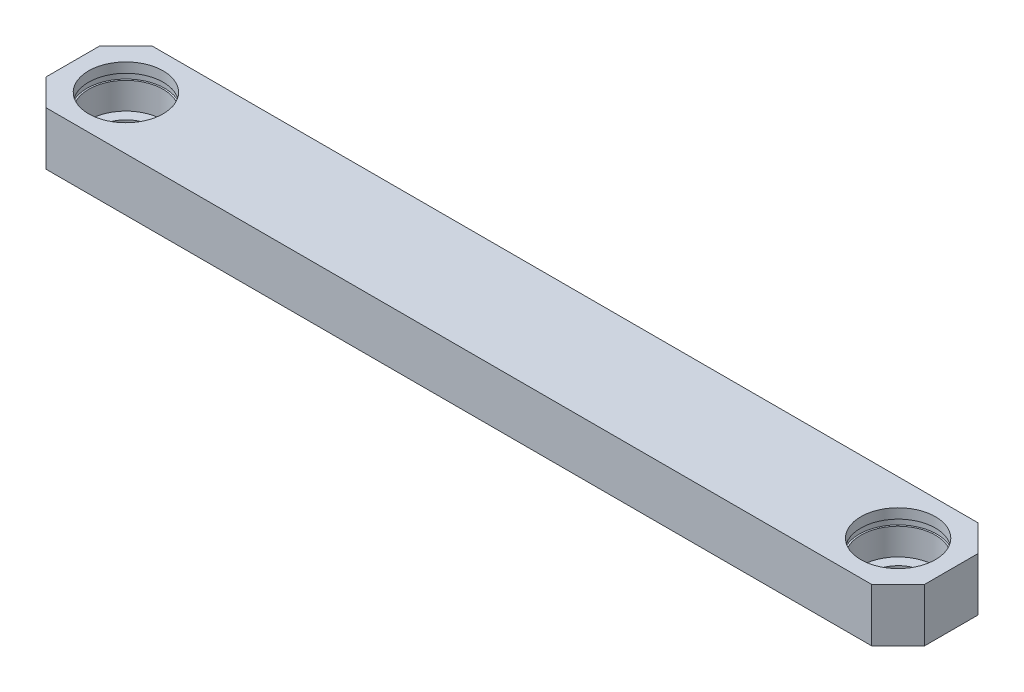
ISO-10303-21;
HEADER;
FILE_DESCRIPTION(('STEP AP214'),'2;1');
FILE_NAME('part.step','',(''),(''),'','','');
FILE_SCHEMA(('AUTOMOTIVE_DESIGN { 1 0 10303 214 1 1 1 1 }'));
ENDSEC;
DATA;
#1=APPLICATION_CONTEXT('core data for automotive mechanical design processes');
#2=APPLICATION_PROTOCOL_DEFINITION('international standard','automotive_design',2000,#1);
#3=PRODUCT_CONTEXT('',#1,'mechanical');
#4=PRODUCT('Part','Part','',(#3));
#5=PRODUCT_RELATED_PRODUCT_CATEGORY('part','',(#4));
#6=PRODUCT_DEFINITION_FORMATION('','',#4);
#7=PRODUCT_DEFINITION_CONTEXT('part definition',#1,'design');
#8=PRODUCT_DEFINITION('design','',#6,#7);
#9=PRODUCT_DEFINITION_SHAPE('','',#8);
#10=(LENGTH_UNIT() NAMED_UNIT(*) SI_UNIT(.MILLI.,.METRE.));
#11=(NAMED_UNIT(*) PLANE_ANGLE_UNIT() SI_UNIT($,.RADIAN.));
#12=(NAMED_UNIT(*) SI_UNIT($,.STERADIAN.) SOLID_ANGLE_UNIT());
#13=UNCERTAINTY_MEASURE_WITH_UNIT(LENGTH_MEASURE(1.E-05),#10,'distance_accuracy_value','');
#14=(GEOMETRIC_REPRESENTATION_CONTEXT(3) GLOBAL_UNCERTAINTY_ASSIGNED_CONTEXT((#13)) GLOBAL_UNIT_ASSIGNED_CONTEXT((#10,
#11,#12)) REPRESENTATION_CONTEXT('',''));
#15=CARTESIAN_POINT('',(0.,0.,0.));
#16=DIRECTION('',(0.,0.,1.));
#17=DIRECTION('',(1.,0.,0.));
#18=AXIS2_PLACEMENT_3D('',#15,#16,#17);
#19=CARTESIAN_POINT('',(0.,10.,-10.));
#20=DIRECTION('',(1.,0.,0.));
#21=DIRECTION('',(0.,0.,-1.));
#22=AXIS2_PLACEMENT_3D('',#19,#20,#21);
#23=PLANE('',#22);
#24=DIRECTION('',(0.,0.,1.));
#25=VECTOR('',#24,1.);
#26=CARTESIAN_POINT('',(0.,10.,-10.));
#27=LINE('',#26,#25);
#28=CARTESIAN_POINT('',(0.,10.,-5.00000000000001));
#29=VERTEX_POINT('',#28);
#30=CARTESIAN_POINT('',(0.,10.,4.99999999999998));
#31=VERTEX_POINT('',#30);
#32=EDGE_CURVE('E118',#29,#31,#27,.T.);
#33=ORIENTED_EDGE('',*,*,#32,.F.);
#34=DIRECTION('',(0.,-1.,0.));
#35=VECTOR('',#34,1.);
#36=CARTESIAN_POINT('',(0.,10.,-5.00000000000001));
#37=LINE('',#36,#35);
#38=CARTESIAN_POINT('',(0.,0.,-5.00000000000001));
#39=VERTEX_POINT('',#38);
#40=EDGE_CURVE('E103',#29,#39,#37,.T.);
#41=ORIENTED_EDGE('',*,*,#40,.T.);
#42=DIRECTION('',(0.,0.,1.));
#43=VECTOR('',#42,1.);
#44=CARTESIAN_POINT('',(0.,0.,-10.));
#45=LINE('',#44,#43);
#46=CARTESIAN_POINT('',(0.,0.,4.99999999999998));
#47=VERTEX_POINT('',#46);
#48=EDGE_CURVE('E115',#39,#47,#45,.T.);
#49=ORIENTED_EDGE('',*,*,#48,.T.);
#50=DIRECTION('',(0.,1.,0.));
#51=VECTOR('',#50,1.);
#52=CARTESIAN_POINT('',(0.,10.,4.99999999999998));
#53=LINE('',#52,#51);
#54=EDGE_CURVE('E120',#47,#31,#53,.T.);
#55=ORIENTED_EDGE('',*,*,#54,.T.);
#56=EDGE_LOOP('',(#33,#41,#49,#55));
#57=FACE_BOUND('',#56,.T.);
#58=ADVANCED_FACE('F33',(#57),#23,.F.);
#59=CARTESIAN_POINT('',(0.,10.,10.));
#60=DIRECTION('',(0.,0.,-1.));
#61=DIRECTION('',(-1.,0.,0.));
#62=AXIS2_PLACEMENT_3D('',#59,#60,#61);
#63=PLANE('',#62);
#64=DIRECTION('',(1.,0.,0.));
#65=VECTOR('',#64,1.);
#66=CARTESIAN_POINT('',(0.,0.,10.));
#67=LINE('',#66,#65);
#68=CARTESIAN_POINT('',(4.99999999999999,0.,10.));
#69=VERTEX_POINT('',#68);
#70=CARTESIAN_POINT('',(160.,0.,10.));
#71=VERTEX_POINT('',#70);
#72=EDGE_CURVE('E124',#69,#71,#67,.T.);
#73=ORIENTED_EDGE('',*,*,#72,.T.);
#74=DIRECTION('',(0.,1.,0.));
#75=VECTOR('',#74,1.);
#76=CARTESIAN_POINT('',(160.,10.,10.));
#77=LINE('',#76,#75);
#78=CARTESIAN_POINT('',(160.,10.,10.));
#79=VERTEX_POINT('',#78);
#80=EDGE_CURVE('E11',#71,#79,#77,.T.);
#81=ORIENTED_EDGE('',*,*,#80,.T.);
#82=DIRECTION('',(1.,0.,0.));
#83=VECTOR('',#82,1.);
#84=CARTESIAN_POINT('',(0.,10.,10.));
#85=LINE('',#84,#83);
#86=CARTESIAN_POINT('',(4.99999999999999,10.,10.));
#87=VERTEX_POINT('',#86);
#88=EDGE_CURVE('E164',#87,#79,#85,.T.);
#89=ORIENTED_EDGE('',*,*,#88,.F.);
#90=DIRECTION('',(0.,-1.,0.));
#91=VECTOR('',#90,1.);
#92=CARTESIAN_POINT('',(4.99999999999999,10.,10.));
#93=LINE('',#92,#91);
#94=EDGE_CURVE('E41',#87,#69,#93,.T.);
#95=ORIENTED_EDGE('',*,*,#94,.T.);
#96=EDGE_LOOP('',(#73,#81,#89,#95));
#97=FACE_BOUND('',#96,.T.);
#98=ADVANCED_FACE('F162',(#97),#63,.F.);
#99=CARTESIAN_POINT('',(165.,10.,-10.));
#100=DIRECTION('',(-1.,0.,0.));
#101=DIRECTION('',(0.,0.,1.));
#102=AXIS2_PLACEMENT_3D('',#99,#100,#101);
#103=PLANE('',#102);
#104=DIRECTION('',(0.,0.,-1.));
#105=VECTOR('',#104,1.);
#106=CARTESIAN_POINT('',(165.,0.,-10.));
#107=LINE('',#106,#105);
#108=CARTESIAN_POINT('',(165.,0.,5.00000000000001));
#109=VERTEX_POINT('',#108);
#110=CARTESIAN_POINT('',(165.,0.,-5.));
#111=VERTEX_POINT('',#110);
#112=EDGE_CURVE('E128',#109,#111,#107,.T.);
#113=ORIENTED_EDGE('',*,*,#112,.T.);
#114=DIRECTION('',(0.,1.,0.));
#115=VECTOR('',#114,1.);
#116=CARTESIAN_POINT('',(165.,10.,-5.));
#117=LINE('',#116,#115);
#118=CARTESIAN_POINT('',(165.,10.,-5.));
#119=VERTEX_POINT('',#118);
#120=EDGE_CURVE('E48',#111,#119,#117,.T.);
#121=ORIENTED_EDGE('',*,*,#120,.T.);
#122=DIRECTION('',(0.,0.,-1.));
#123=VECTOR('',#122,1.);
#124=CARTESIAN_POINT('',(165.,10.,-10.));
#125=LINE('',#124,#123);
#126=CARTESIAN_POINT('',(165.,10.,5.00000000000001));
#127=VERTEX_POINT('',#126);
#128=EDGE_CURVE('E172',#127,#119,#125,.T.);
#129=ORIENTED_EDGE('',*,*,#128,.F.);
#130=DIRECTION('',(0.,-1.,0.));
#131=VECTOR('',#130,1.);
#132=CARTESIAN_POINT('',(165.,10.,5.00000000000001));
#133=LINE('',#132,#131);
#134=EDGE_CURVE('E155',#127,#109,#133,.T.);
#135=ORIENTED_EDGE('',*,*,#134,.T.);
#136=EDGE_LOOP('',(#113,#121,#129,#135));
#137=FACE_BOUND('',#136,.T.);
#138=ADVANCED_FACE('F171',(#137),#103,.F.);
#139=CARTESIAN_POINT('',(0.,10.,-10.));
#140=DIRECTION('',(0.,0.,1.));
#141=DIRECTION('',(1.,0.,0.));
#142=AXIS2_PLACEMENT_3D('',#139,#140,#141);
#143=PLANE('',#142);
#144=DIRECTION('',(-1.,0.,0.));
#145=VECTOR('',#144,1.);
#146=CARTESIAN_POINT('',(0.,0.,-10.));
#147=LINE('',#146,#145);
#148=CARTESIAN_POINT('',(160.,0.,-10.));
#149=VERTEX_POINT('',#148);
#150=CARTESIAN_POINT('',(5.00000000000001,0.,-10.));
#151=VERTEX_POINT('',#150);
#152=EDGE_CURVE('E138',#149,#151,#147,.T.);
#153=ORIENTED_EDGE('',*,*,#152,.T.);
#154=DIRECTION('',(0.,1.,0.));
#155=VECTOR('',#154,1.);
#156=CARTESIAN_POINT('',(5.00000000000001,10.,-10.));
#157=LINE('',#156,#155);
#158=CARTESIAN_POINT('',(5.00000000000001,10.,-10.));
#159=VERTEX_POINT('',#158);
#160=EDGE_CURVE('E104',#151,#159,#157,.T.);
#161=ORIENTED_EDGE('',*,*,#160,.T.);
#162=DIRECTION('',(-1.,0.,0.));
#163=VECTOR('',#162,1.);
#164=CARTESIAN_POINT('',(0.,10.,-10.));
#165=LINE('',#164,#163);
#166=CARTESIAN_POINT('',(160.,10.,-10.));
#167=VERTEX_POINT('',#166);
#168=EDGE_CURVE('E134',#167,#159,#165,.T.);
#169=ORIENTED_EDGE('',*,*,#168,.F.);
#170=DIRECTION('',(0.,-1.,0.));
#171=VECTOR('',#170,1.);
#172=CARTESIAN_POINT('',(160.,10.,-10.));
#173=LINE('',#172,#171);
#174=EDGE_CURVE('E109',#167,#149,#173,.T.);
#175=ORIENTED_EDGE('',*,*,#174,.T.);
#176=EDGE_LOOP('',(#153,#161,#169,#175));
#177=FACE_BOUND('',#176,.T.);
#178=ADVANCED_FACE('F228',(#177),#143,.F.);
#179=CARTESIAN_POINT('',(0.,10.,0.));
#180=DIRECTION('',(0.,1.,0.));
#181=DIRECTION('',(0.,0.,1.));
#182=AXIS2_PLACEMENT_3D('',#179,#180,#181);
#183=PLANE('',#182);
#184=CARTESIAN_POINT('',(155.,10.,0.));
#185=DIRECTION('',(0.,1.,0.));
#186=DIRECTION('',(0.,0.,1.));
#187=AXIS2_PLACEMENT_3D('',#184,#185,#186);
#188=CIRCLE('',#187,7.00000000000001);
#189=CARTESIAN_POINT('',(155.,10.,7.00000000000001));
#190=VERTEX_POINT('',#189);
#191=EDGE_CURVE('E219',#190,#190,#188,.T.);
#192=ORIENTED_EDGE('',*,*,#191,.F.);
#193=EDGE_LOOP('',(#192));
#194=FACE_BOUND('',#193,.T.);
#195=CARTESIAN_POINT('',(10.,10.,0.));
#196=DIRECTION('',(0.,1.,0.));
#197=DIRECTION('',(-1.,0.,0.));
#198=AXIS2_PLACEMENT_3D('',#195,#196,#197);
#199=CIRCLE('',#198,7.);
#200=CARTESIAN_POINT('',(3.,10.,0.));
#201=VERTEX_POINT('',#200);
#202=EDGE_CURVE('E192',#201,#201,#199,.T.);
#203=ORIENTED_EDGE('',*,*,#202,.F.);
#204=EDGE_LOOP('',(#203));
#205=FACE_BOUND('',#204,.T.);
#206=ORIENTED_EDGE('',*,*,#168,.T.);
#207=DIRECTION('',(0.707106781186549,0.,-0.707106781186547));
#208=VECTOR('',#207,1.);
#209=CARTESIAN_POINT('',(-2.5,10.,-2.50000000000001));
#210=LINE('',#209,#208);
#211=EDGE_CURVE('E153',#159,#29,#210,.F.);
#212=ORIENTED_EDGE('',*,*,#211,.T.);
#213=ORIENTED_EDGE('',*,*,#32,.T.);
#214=DIRECTION('',(-0.707106781186546,0.,-0.70710678118655));
#215=VECTOR('',#214,1.);
#216=CARTESIAN_POINT('',(-2.49999999999999,10.,2.49999999999997));
#217=LINE('',#216,#215);
#218=EDGE_CURVE('E148',#31,#87,#217,.F.);
#219=ORIENTED_EDGE('',*,*,#218,.T.);
#220=ORIENTED_EDGE('',*,*,#88,.T.);
#221=DIRECTION('',(-0.707106781186549,0.,0.707106781186547));
#222=VECTOR('',#221,1.);
#223=CARTESIAN_POINT('',(84.9999999999998,10.,85.));
#224=LINE('',#223,#222);
#225=EDGE_CURVE('E55',#79,#127,#224,.F.);
#226=ORIENTED_EDGE('',*,*,#225,.T.);
#227=ORIENTED_EDGE('',*,*,#128,.T.);
#228=DIRECTION('',(0.707106781186546,0.,0.707106781186549));
#229=VECTOR('',#228,1.);
#230=CARTESIAN_POINT('',(85.0000000000005,10.,-85.));
#231=LINE('',#230,#229);
#232=EDGE_CURVE('E151',#119,#167,#231,.F.);
#233=ORIENTED_EDGE('',*,*,#232,.T.);
#234=EDGE_LOOP('',(#206,#212,#213,#219,#220,#226,#227,#233));
#235=FACE_BOUND('',#234,.T.);
#236=ADVANCED_FACE('F225',(#194,#205,#235),#183,.T.);
#237=CARTESIAN_POINT('',(0.,0.,0.));
#238=DIRECTION('',(0.,1.,0.));
#239=DIRECTION('',(0.,0.,1.));
#240=AXIS2_PLACEMENT_3D('',#237,#238,#239);
#241=PLANE('',#240);
#242=CARTESIAN_POINT('',(155.,0.,0.));
#243=DIRECTION('',(0.,1.,0.));
#244=DIRECTION('',(0.,0.,1.));
#245=AXIS2_PLACEMENT_3D('',#242,#243,#244);
#246=CIRCLE('',#245,5.);
#247=CARTESIAN_POINT('',(155.,0.,5.));
#248=VERTEX_POINT('',#247);
#249=EDGE_CURVE('E198',#248,#248,#246,.T.);
#250=ORIENTED_EDGE('',*,*,#249,.T.);
#251=EDGE_LOOP('',(#250));
#252=FACE_BOUND('',#251,.T.);
#253=CARTESIAN_POINT('',(10.,0.,0.));
#254=DIRECTION('',(0.,1.,0.));
#255=DIRECTION('',(-1.,0.,0.));
#256=AXIS2_PLACEMENT_3D('',#253,#254,#255);
#257=CIRCLE('',#256,5.);
#258=CARTESIAN_POINT('',(5.,0.,0.));
#259=VERTEX_POINT('',#258);
#260=EDGE_CURVE('E189',#259,#259,#257,.T.);
#261=ORIENTED_EDGE('',*,*,#260,.T.);
#262=EDGE_LOOP('',(#261));
#263=FACE_BOUND('',#262,.T.);
#264=ORIENTED_EDGE('',*,*,#48,.F.);
#265=DIRECTION('',(-0.707106781186549,0.,0.707106781186547));
#266=VECTOR('',#265,1.);
#267=CARTESIAN_POINT('',(0.,0.,-5.00000000000001));
#268=LINE('',#267,#266);
#269=EDGE_CURVE('E99',#39,#151,#268,.F.);
#270=ORIENTED_EDGE('',*,*,#269,.T.);
#271=ORIENTED_EDGE('',*,*,#152,.F.);
#272=DIRECTION('',(-0.707106781186546,0.,-0.707106781186549));
#273=VECTOR('',#272,1.);
#274=CARTESIAN_POINT('',(160.,0.,-10.));
#275=LINE('',#274,#273);
#276=EDGE_CURVE('E110',#149,#111,#275,.F.);
#277=ORIENTED_EDGE('',*,*,#276,.T.);
#278=ORIENTED_EDGE('',*,*,#112,.F.);
#279=DIRECTION('',(0.707106781186549,0.,-0.707106781186547));
#280=VECTOR('',#279,1.);
#281=CARTESIAN_POINT('',(165.,0.,5.00000000000001));
#282=LINE('',#281,#280);
#283=EDGE_CURVE('E142',#109,#71,#282,.F.);
#284=ORIENTED_EDGE('',*,*,#283,.T.);
#285=ORIENTED_EDGE('',*,*,#72,.F.);
#286=DIRECTION('',(0.707106781186546,0.,0.70710678118655));
#287=VECTOR('',#286,1.);
#288=CARTESIAN_POINT('',(4.99999999999999,0.,10.));
#289=LINE('',#288,#287);
#290=EDGE_CURVE('E119',#69,#47,#289,.F.);
#291=ORIENTED_EDGE('',*,*,#290,.T.);
#292=EDGE_LOOP('',(#264,#270,#271,#277,#278,#284,#285,#291));
#293=FACE_BOUND('',#292,.T.);
#294=ADVANCED_FACE('F122',(#252,#263,#293),#241,.F.);
#295=CARTESIAN_POINT('',(0.,10.,-5.00000000000001));
#296=DIRECTION('',(0.707106781186546,0.,0.707106781186548));
#297=DIRECTION('',(0.,-1.,0.));
#298=AXIS2_PLACEMENT_3D('',#295,#296,#297);
#299=PLANE('',#298);
#300=ORIENTED_EDGE('',*,*,#211,.F.);
#301=ORIENTED_EDGE('',*,*,#160,.F.);
#302=ORIENTED_EDGE('',*,*,#269,.F.);
#303=ORIENTED_EDGE('',*,*,#40,.F.);
#304=EDGE_LOOP('',(#300,#301,#302,#303));
#305=FACE_BOUND('',#304,.T.);
#306=ADVANCED_FACE('F102',(#305),#299,.F.);
#307=CARTESIAN_POINT('',(160.,10.,-10.));
#308=DIRECTION('',(-0.707106781186549,0.,0.707106781186546));
#309=DIRECTION('',(0.,-1.,0.));
#310=AXIS2_PLACEMENT_3D('',#307,#308,#309);
#311=PLANE('',#310);
#312=ORIENTED_EDGE('',*,*,#232,.F.);
#313=ORIENTED_EDGE('',*,*,#120,.F.);
#314=ORIENTED_EDGE('',*,*,#276,.F.);
#315=ORIENTED_EDGE('',*,*,#174,.F.);
#316=EDGE_LOOP('',(#312,#313,#314,#315));
#317=FACE_BOUND('',#316,.T.);
#318=ADVANCED_FACE('F235',(#317),#311,.F.);
#319=CARTESIAN_POINT('',(165.,10.,5.00000000000001));
#320=DIRECTION('',(-0.707106781186546,0.,-0.707106781186548));
#321=DIRECTION('',(0.,-1.,0.));
#322=AXIS2_PLACEMENT_3D('',#319,#320,#321);
#323=PLANE('',#322);
#324=ORIENTED_EDGE('',*,*,#225,.F.);
#325=ORIENTED_EDGE('',*,*,#80,.F.);
#326=ORIENTED_EDGE('',*,*,#283,.F.);
#327=ORIENTED_EDGE('',*,*,#134,.F.);
#328=EDGE_LOOP('',(#324,#325,#326,#327));
#329=FACE_BOUND('',#328,.T.);
#330=ADVANCED_FACE('F170',(#329),#323,.F.);
#331=CARTESIAN_POINT('',(4.99999999999999,10.,10.));
#332=DIRECTION('',(0.707106781186549,0.,-0.707106781186545));
#333=DIRECTION('',(0.,-1.,0.));
#334=AXIS2_PLACEMENT_3D('',#331,#332,#333);
#335=PLANE('',#334);
#336=ORIENTED_EDGE('',*,*,#218,.F.);
#337=ORIENTED_EDGE('',*,*,#54,.F.);
#338=ORIENTED_EDGE('',*,*,#290,.F.);
#339=ORIENTED_EDGE('',*,*,#94,.F.);
#340=EDGE_LOOP('',(#336,#337,#338,#339));
#341=FACE_BOUND('',#340,.T.);
#342=ADVANCED_FACE('F35',(#341),#335,.F.);
#343=CARTESIAN_POINT('',(3.,8.15,0.));
#344=DIRECTION('',(0.,1.,0.));
#345=DIRECTION('',(-1.,0.,0.));
#346=AXIS2_PLACEMENT_3D('',#343,#344,#345);
#347=PLANE('',#346);
#348=CARTESIAN_POINT('',(10.,8.15,0.));
#349=DIRECTION('',(0.,1.,0.));
#350=DIRECTION('',(-1.,0.,0.));
#351=AXIS2_PLACEMENT_3D('',#348,#349,#350);
#352=CIRCLE('',#351,7.3);
#353=CARTESIAN_POINT('',(2.7,8.15,0.));
#354=VERTEX_POINT('',#353);
#355=EDGE_CURVE('E125',#354,#354,#352,.T.);
#356=ORIENTED_EDGE('',*,*,#355,.F.);
#357=EDGE_LOOP('',(#356));
#358=FACE_BOUND('',#357,.T.);
#359=CARTESIAN_POINT('',(10.,8.15,0.));
#360=DIRECTION('',(0.,1.,0.));
#361=DIRECTION('',(-1.,0.,0.));
#362=AXIS2_PLACEMENT_3D('',#359,#360,#361);
#363=CIRCLE('',#362,7.);
#364=CARTESIAN_POINT('',(3.,8.15,0.));
#365=VERTEX_POINT('',#364);
#366=EDGE_CURVE('E195',#365,#365,#363,.T.);
#367=ORIENTED_EDGE('',*,*,#366,.T.);
#368=EDGE_LOOP('',(#367));
#369=FACE_BOUND('',#368,.T.);
#370=ADVANCED_FACE('F257',(#358,#369),#347,.F.);
#371=CARTESIAN_POINT('',(10.,10.,0.));
#372=DIRECTION('',(0.,1.,0.));
#373=DIRECTION('',(-1.,0.,0.));
#374=AXIS2_PLACEMENT_3D('',#371,#372,#373);
#375=CYLINDRICAL_SURFACE('',#374,7.3);
#376=CARTESIAN_POINT('',(10.,7.,0.));
#377=DIRECTION('',(0.,1.,0.));
#378=DIRECTION('',(-1.,0.,0.));
#379=AXIS2_PLACEMENT_3D('',#376,#377,#378);
#380=CIRCLE('',#379,7.3);
#381=CARTESIAN_POINT('',(2.7,7.,0.));
#382=VERTEX_POINT('',#381);
#383=EDGE_CURVE('E131',#382,#382,#380,.T.);
#384=ORIENTED_EDGE('',*,*,#383,.F.);
#385=EDGE_LOOP('',(#384));
#386=FACE_BOUND('',#385,.T.);
#387=ORIENTED_EDGE('',*,*,#355,.T.);
#388=EDGE_LOOP('',(#387));
#389=FACE_BOUND('',#388,.T.);
#390=ADVANCED_FACE('F260',(#386,#389),#375,.F.);
#391=CARTESIAN_POINT('',(2.7,7.,0.));
#392=DIRECTION('',(0.,-1.,0.));
#393=DIRECTION('',(1.,0.,0.));
#394=AXIS2_PLACEMENT_3D('',#391,#392,#393);
#395=PLANE('',#394);
#396=CARTESIAN_POINT('',(10.,7.,0.));
#397=DIRECTION('',(0.,1.,0.));
#398=DIRECTION('',(-1.,0.,0.));
#399=AXIS2_PLACEMENT_3D('',#396,#397,#398);
#400=CIRCLE('',#399,7.);
#401=CARTESIAN_POINT('',(3.,7.,0.));
#402=VERTEX_POINT('',#401);
#403=EDGE_CURVE('E180',#402,#402,#400,.T.);
#404=ORIENTED_EDGE('',*,*,#403,.F.);
#405=EDGE_LOOP('',(#404));
#406=FACE_BOUND('',#405,.T.);
#407=ORIENTED_EDGE('',*,*,#383,.T.);
#408=EDGE_LOOP('',(#407));
#409=FACE_BOUND('',#408,.T.);
#410=ADVANCED_FACE('F264',(#406,#409),#395,.F.);
#411=CARTESIAN_POINT('',(10.,10.,0.));
#412=DIRECTION('',(0.,1.,0.));
#413=DIRECTION('',(-1.,0.,0.));
#414=AXIS2_PLACEMENT_3D('',#411,#412,#413);
#415=CYLINDRICAL_SURFACE('',#414,7.);
#416=CARTESIAN_POINT('',(10.,2.,0.));
#417=DIRECTION('',(0.,1.,0.));
#418=DIRECTION('',(-1.,0.,0.));
#419=AXIS2_PLACEMENT_3D('',#416,#417,#418);
#420=CIRCLE('',#419,7.);
#421=CARTESIAN_POINT('',(3.,2.,0.));
#422=VERTEX_POINT('',#421);
#423=EDGE_CURVE('E183',#422,#422,#420,.T.);
#424=ORIENTED_EDGE('',*,*,#423,.F.);
#425=EDGE_LOOP('',(#424));
#426=FACE_BOUND('',#425,.T.);
#427=ORIENTED_EDGE('',*,*,#403,.T.);
#428=EDGE_LOOP('',(#427));
#429=FACE_BOUND('',#428,.T.);
#430=ADVANCED_FACE('F268',(#426,#429),#415,.F.);
#431=CARTESIAN_POINT('',(3.,2.,0.));
#432=DIRECTION('',(0.,-1.,0.));
#433=DIRECTION('',(1.,0.,0.));
#434=AXIS2_PLACEMENT_3D('',#431,#432,#433);
#435=PLANE('',#434);
#436=CARTESIAN_POINT('',(10.,2.,0.));
#437=DIRECTION('',(0.,1.,0.));
#438=DIRECTION('',(-1.,0.,0.));
#439=AXIS2_PLACEMENT_3D('',#436,#437,#438);
#440=CIRCLE('',#439,5.);
#441=CARTESIAN_POINT('',(5.,2.,0.));
#442=VERTEX_POINT('',#441);
#443=EDGE_CURVE('E186',#442,#442,#440,.T.);
#444=ORIENTED_EDGE('',*,*,#443,.F.);
#445=EDGE_LOOP('',(#444));
#446=FACE_BOUND('',#445,.T.);
#447=ORIENTED_EDGE('',*,*,#423,.T.);
#448=EDGE_LOOP('',(#447));
#449=FACE_BOUND('',#448,.T.);
#450=ADVANCED_FACE('F272',(#446,#449),#435,.F.);
#451=CARTESIAN_POINT('',(10.,10.,0.));
#452=DIRECTION('',(0.,1.,0.));
#453=DIRECTION('',(-1.,0.,0.));
#454=AXIS2_PLACEMENT_3D('',#451,#452,#453);
#455=CYLINDRICAL_SURFACE('',#454,5.);
#456=ORIENTED_EDGE('',*,*,#260,.F.);
#457=EDGE_LOOP('',(#456));
#458=FACE_BOUND('',#457,.T.);
#459=ORIENTED_EDGE('',*,*,#443,.T.);
#460=EDGE_LOOP('',(#459));
#461=FACE_BOUND('',#460,.T.);
#462=ADVANCED_FACE('F276',(#458,#461),#455,.F.);
#463=CARTESIAN_POINT('',(10.,10.,0.));
#464=DIRECTION('',(0.,1.,0.));
#465=DIRECTION('',(-1.,0.,0.));
#466=AXIS2_PLACEMENT_3D('',#463,#464,#465);
#467=CYLINDRICAL_SURFACE('',#466,7.);
#468=ORIENTED_EDGE('',*,*,#366,.F.);
#469=EDGE_LOOP('',(#468));
#470=FACE_BOUND('',#469,.T.);
#471=ORIENTED_EDGE('',*,*,#202,.T.);
#472=EDGE_LOOP('',(#471));
#473=FACE_BOUND('',#472,.T.);
#474=ADVANCED_FACE('F280',(#470,#473),#467,.F.);
#475=CARTESIAN_POINT('',(155.,10.,0.));
#476=DIRECTION('',(0.,1.,0.));
#477=DIRECTION('',(0.,0.,1.));
#478=AXIS2_PLACEMENT_3D('',#475,#476,#477);
#479=CYLINDRICAL_SURFACE('',#478,5.);
#480=ORIENTED_EDGE('',*,*,#249,.F.);
#481=EDGE_LOOP('',(#480));
#482=FACE_BOUND('',#481,.T.);
#483=CARTESIAN_POINT('',(155.,2.,0.));
#484=DIRECTION('',(0.,1.,0.));
#485=DIRECTION('',(0.,0.,1.));
#486=AXIS2_PLACEMENT_3D('',#483,#484,#485);
#487=CIRCLE('',#486,5.);
#488=CARTESIAN_POINT('',(155.,2.,5.));
#489=VERTEX_POINT('',#488);
#490=EDGE_CURVE('E201',#489,#489,#487,.T.);
#491=ORIENTED_EDGE('',*,*,#490,.T.);
#492=EDGE_LOOP('',(#491));
#493=FACE_BOUND('',#492,.T.);
#494=ADVANCED_FACE('F284',(#482,#493),#479,.F.);
#495=CARTESIAN_POINT('',(148.,2.,0.));
#496=DIRECTION('',(0.,-1.,0.));
#497=DIRECTION('',(0.,0.,-1.));
#498=AXIS2_PLACEMENT_3D('',#495,#496,#497);
#499=PLANE('',#498);
#500=ORIENTED_EDGE('',*,*,#490,.F.);
#501=EDGE_LOOP('',(#500));
#502=FACE_BOUND('',#501,.T.);
#503=CARTESIAN_POINT('',(155.,2.,0.));
#504=DIRECTION('',(0.,1.,0.));
#505=DIRECTION('',(0.,0.,1.));
#506=AXIS2_PLACEMENT_3D('',#503,#504,#505);
#507=CIRCLE('',#506,7.00000000000001);
#508=CARTESIAN_POINT('',(155.,2.,7.00000000000001));
#509=VERTEX_POINT('',#508);
#510=EDGE_CURVE('E204',#509,#509,#507,.T.);
#511=ORIENTED_EDGE('',*,*,#510,.T.);
#512=EDGE_LOOP('',(#511));
#513=FACE_BOUND('',#512,.T.);
#514=ADVANCED_FACE('F288',(#502,#513),#499,.F.);
#515=CARTESIAN_POINT('',(155.,10.,0.));
#516=DIRECTION('',(0.,1.,0.));
#517=DIRECTION('',(0.,0.,1.));
#518=AXIS2_PLACEMENT_3D('',#515,#516,#517);
#519=CYLINDRICAL_SURFACE('',#518,7.00000000000001);
#520=ORIENTED_EDGE('',*,*,#510,.F.);
#521=EDGE_LOOP('',(#520));
#522=FACE_BOUND('',#521,.T.);
#523=CARTESIAN_POINT('',(155.,7.,0.));
#524=DIRECTION('',(0.,1.,0.));
#525=DIRECTION('',(0.,0.,1.));
#526=AXIS2_PLACEMENT_3D('',#523,#524,#525);
#527=CIRCLE('',#526,7.00000000000001);
#528=CARTESIAN_POINT('',(155.,7.,7.00000000000001));
#529=VERTEX_POINT('',#528);
#530=EDGE_CURVE('E207',#529,#529,#527,.T.);
#531=ORIENTED_EDGE('',*,*,#530,.T.);
#532=EDGE_LOOP('',(#531));
#533=FACE_BOUND('',#532,.T.);
#534=ADVANCED_FACE('F292',(#522,#533),#519,.F.);
#535=CARTESIAN_POINT('',(147.7,7.,0.));
#536=DIRECTION('',(0.,-1.,0.));
#537=DIRECTION('',(0.,0.,-1.));
#538=AXIS2_PLACEMENT_3D('',#535,#536,#537);
#539=PLANE('',#538);
#540=ORIENTED_EDGE('',*,*,#530,.F.);
#541=EDGE_LOOP('',(#540));
#542=FACE_BOUND('',#541,.T.);
#543=CARTESIAN_POINT('',(155.,7.,0.));
#544=DIRECTION('',(0.,1.,0.));
#545=DIRECTION('',(0.,0.,1.));
#546=AXIS2_PLACEMENT_3D('',#543,#544,#545);
#547=CIRCLE('',#546,7.3);
#548=CARTESIAN_POINT('',(155.,7.,7.3));
#549=VERTEX_POINT('',#548);
#550=EDGE_CURVE('E210',#549,#549,#547,.T.);
#551=ORIENTED_EDGE('',*,*,#550,.T.);
#552=EDGE_LOOP('',(#551));
#553=FACE_BOUND('',#552,.T.);
#554=ADVANCED_FACE('F296',(#542,#553),#539,.F.);
#555=CARTESIAN_POINT('',(155.,10.,0.));
#556=DIRECTION('',(0.,1.,0.));
#557=DIRECTION('',(0.,0.,1.));
#558=AXIS2_PLACEMENT_3D('',#555,#556,#557);
#559=CYLINDRICAL_SURFACE('',#558,7.3);
#560=ORIENTED_EDGE('',*,*,#550,.F.);
#561=EDGE_LOOP('',(#560));
#562=FACE_BOUND('',#561,.T.);
#563=CARTESIAN_POINT('',(155.,8.15,0.));
#564=DIRECTION('',(0.,1.,0.));
#565=DIRECTION('',(0.,0.,1.));
#566=AXIS2_PLACEMENT_3D('',#563,#564,#565);
#567=CIRCLE('',#566,7.3);
#568=CARTESIAN_POINT('',(155.,8.15,7.3));
#569=VERTEX_POINT('',#568);
#570=EDGE_CURVE('E213',#569,#569,#567,.T.);
#571=ORIENTED_EDGE('',*,*,#570,.T.);
#572=EDGE_LOOP('',(#571));
#573=FACE_BOUND('',#572,.T.);
#574=ADVANCED_FACE('F300',(#562,#573),#559,.F.);
#575=CARTESIAN_POINT('',(148.,8.15,0.));
#576=DIRECTION('',(0.,1.,0.));
#577=DIRECTION('',(0.,0.,1.));
#578=AXIS2_PLACEMENT_3D('',#575,#576,#577);
#579=PLANE('',#578);
#580=ORIENTED_EDGE('',*,*,#570,.F.);
#581=EDGE_LOOP('',(#580));
#582=FACE_BOUND('',#581,.T.);
#583=CARTESIAN_POINT('',(155.,8.15,0.));
#584=DIRECTION('',(0.,1.,0.));
#585=DIRECTION('',(0.,0.,1.));
#586=AXIS2_PLACEMENT_3D('',#583,#584,#585);
#587=CIRCLE('',#586,7.00000000000001);
#588=CARTESIAN_POINT('',(155.,8.15,7.00000000000001));
#589=VERTEX_POINT('',#588);
#590=EDGE_CURVE('E216',#589,#589,#587,.T.);
#591=ORIENTED_EDGE('',*,*,#590,.T.);
#592=EDGE_LOOP('',(#591));
#593=FACE_BOUND('',#592,.T.);
#594=ADVANCED_FACE('F304',(#582,#593),#579,.F.);
#595=CARTESIAN_POINT('',(155.,10.,0.));
#596=DIRECTION('',(0.,1.,0.));
#597=DIRECTION('',(0.,0.,1.));
#598=AXIS2_PLACEMENT_3D('',#595,#596,#597);
#599=CYLINDRICAL_SURFACE('',#598,7.00000000000001);
#600=ORIENTED_EDGE('',*,*,#590,.F.);
#601=EDGE_LOOP('',(#600));
#602=FACE_BOUND('',#601,.T.);
#603=ORIENTED_EDGE('',*,*,#191,.T.);
#604=EDGE_LOOP('',(#603));
#605=FACE_BOUND('',#604,.T.);
#606=ADVANCED_FACE('F223',(#602,#605),#599,.F.);
#607=CLOSED_SHELL('',(#58,#98,#138,#178,#236,#294,#306,#318,#330,#342,#370,#390,#410,#430,#450,
#462,#474,#494,#514,#534,#554,#574,#594,#606));
#608=MANIFOLD_SOLID_BREP('B2',#607);
#609=ADVANCED_BREP_SHAPE_REPRESENTATION('',(#18,#608),#14);
#610=SHAPE_DEFINITION_REPRESENTATION(#9,#609);
ENDSEC;
END-ISO-10303-21;
